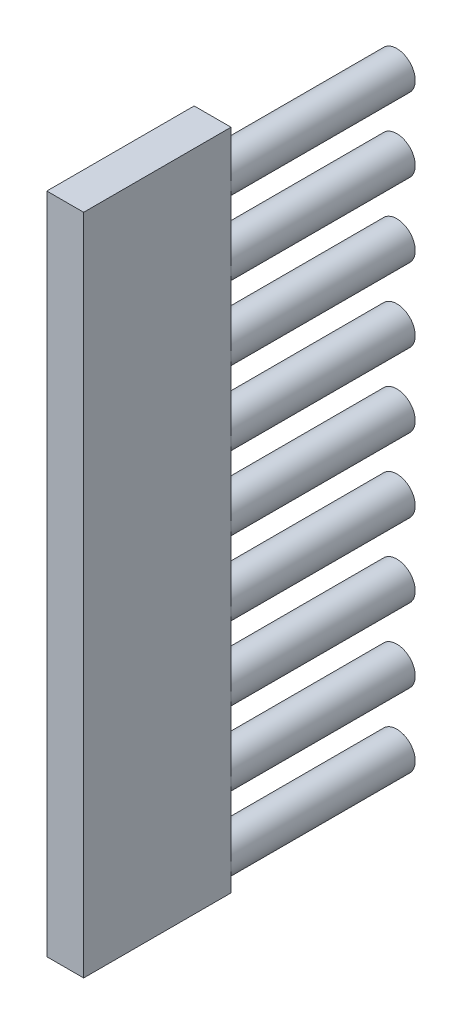
ISO-10303-21;
HEADER;
FILE_DESCRIPTION(('STEP AP214'),'2;1');
FILE_NAME('part.step','',(''),(''),'','','');
FILE_SCHEMA(('AUTOMOTIVE_DESIGN { 1 0 10303 214 1 1 1 1 }'));
ENDSEC;
DATA;
#1=APPLICATION_CONTEXT('core data for automotive mechanical design processes');
#2=APPLICATION_PROTOCOL_DEFINITION('international standard','automotive_design',2000,#1);
#3=PRODUCT_CONTEXT('',#1,'mechanical');
#4=PRODUCT('Part','Part','',(#3));
#5=PRODUCT_RELATED_PRODUCT_CATEGORY('part','',(#4));
#6=PRODUCT_DEFINITION_FORMATION('','',#4);
#7=PRODUCT_DEFINITION_CONTEXT('part definition',#1,'design');
#8=PRODUCT_DEFINITION('design','',#6,#7);
#9=PRODUCT_DEFINITION_SHAPE('','',#8);
#10=(LENGTH_UNIT() NAMED_UNIT(*) SI_UNIT(.MILLI.,.METRE.));
#11=(NAMED_UNIT(*) PLANE_ANGLE_UNIT() SI_UNIT($,.RADIAN.));
#12=(NAMED_UNIT(*) SI_UNIT($,.STERADIAN.) SOLID_ANGLE_UNIT());
#13=UNCERTAINTY_MEASURE_WITH_UNIT(LENGTH_MEASURE(1.E-05),#10,'distance_accuracy_value','');
#14=(GEOMETRIC_REPRESENTATION_CONTEXT(3) GLOBAL_UNCERTAINTY_ASSIGNED_CONTEXT((#13)) GLOBAL_UNIT_ASSIGNED_CONTEXT((#10,
#11,#12)) REPRESENTATION_CONTEXT('',''));
#15=CARTESIAN_POINT('',(0.,0.,0.));
#16=DIRECTION('',(0.,0.,1.));
#17=DIRECTION('',(1.,0.,0.));
#18=AXIS2_PLACEMENT_3D('',#15,#16,#17);
#19=CARTESIAN_POINT('',(5.,0.,0.));
#20=DIRECTION('',(0.,0.,1.));
#21=DIRECTION('',(1.,0.,0.));
#22=AXIS2_PLACEMENT_3D('',#19,#20,#21);
#23=PLANE('',#22);
#24=CARTESIAN_POINT('',(2.5,3.,0.));
#25=DIRECTION('',(0.,0.,-1.));
#26=DIRECTION('',(-1.,0.,0.));
#27=AXIS2_PLACEMENT_3D('',#24,#25,#26);
#28=CIRCLE('',#27,2.5);
#29=CARTESIAN_POINT('',(0.,3.,0.));
#30=VERTEX_POINT('',#29);
#31=CARTESIAN_POINT('',(5.,3.,0.));
#32=VERTEX_POINT('',#31);
#33=EDGE_CURVE('E50',#30,#32,#28,.T.);
#34=ORIENTED_EDGE('',*,*,#33,.F.);
#35=DIRECTION('',(0.,1.,0.));
#36=VECTOR('',#35,1.);
#37=CARTESIAN_POINT('',(0.,0.,0.));
#38=LINE('',#37,#36);
#39=CARTESIAN_POINT('',(1.0321604682062E-13,13.,0.));
#40=VERTEX_POINT('',#39);
#41=EDGE_CURVE('E192',#30,#40,#38,.T.);
#42=ORIENTED_EDGE('',*,*,#41,.T.);
#43=CARTESIAN_POINT('',(2.5000000000001,13.,0.));
#44=DIRECTION('',(0.,0.,-1.));
#45=DIRECTION('',(-1.,0.,0.));
#46=AXIS2_PLACEMENT_3D('',#43,#44,#45);
#47=CIRCLE('',#46,2.5);
#48=CARTESIAN_POINT('',(5.,13.,0.));
#49=VERTEX_POINT('',#48);
#50=EDGE_CURVE('E48',#49,#40,#47,.T.);
#51=ORIENTED_EDGE('',*,*,#50,.F.);
#52=DIRECTION('',(0.,1.,0.));
#53=VECTOR('',#52,1.);
#54=CARTESIAN_POINT('',(5.,0.,0.));
#55=LINE('',#54,#53);
#56=EDGE_CURVE('E184',#32,#49,#55,.T.);
#57=ORIENTED_EDGE('',*,*,#56,.F.);
#58=EDGE_LOOP('',(#34,#42,#51,#57));
#59=FACE_BOUND('',#58,.T.);
#60=ADVANCED_FACE('F39',(#59),#23,.F.);
#61=EDGE_CURVE('E239',#40,#49,#47,.T.);
#62=ORIENTED_EDGE('',*,*,#61,.F.);
#63=CARTESIAN_POINT('',(2.08166817117217E-13,23.,0.));
#64=VERTEX_POINT('',#63);
#65=EDGE_CURVE('E496',#40,#64,#38,.T.);
#66=ORIENTED_EDGE('',*,*,#65,.T.);
#67=CARTESIAN_POINT('',(2.50000000000021,23.,0.));
#68=DIRECTION('',(0.,0.,-1.));
#69=DIRECTION('',(-1.,0.,0.));
#70=AXIS2_PLACEMENT_3D('',#67,#68,#69);
#71=CIRCLE('',#70,2.5);
#72=CARTESIAN_POINT('',(5.,23.,0.));
#73=VERTEX_POINT('',#72);
#74=EDGE_CURVE('E247',#73,#64,#71,.T.);
#75=ORIENTED_EDGE('',*,*,#74,.F.);
#76=EDGE_CURVE('E224',#49,#73,#55,.T.);
#77=ORIENTED_EDGE('',*,*,#76,.F.);
#78=EDGE_LOOP('',(#62,#66,#75,#77));
#79=FACE_BOUND('',#78,.T.);
#80=ADVANCED_FACE('F301',(#79),#23,.F.);
#81=EDGE_CURVE('E245',#64,#73,#71,.T.);
#82=ORIENTED_EDGE('',*,*,#81,.F.);
#83=CARTESIAN_POINT('',(3.10949183068843E-13,33.,0.));
#84=VERTEX_POINT('',#83);
#85=EDGE_CURVE('E498',#64,#84,#38,.T.);
#86=ORIENTED_EDGE('',*,*,#85,.T.);
#87=CARTESIAN_POINT('',(2.50000000000031,33.,0.));
#88=DIRECTION('',(0.,0.,-1.));
#89=DIRECTION('',(-1.,0.,0.));
#90=AXIS2_PLACEMENT_3D('',#87,#88,#89);
#91=CIRCLE('',#90,2.5);
#92=CARTESIAN_POINT('',(5.,33.,0.));
#93=VERTEX_POINT('',#92);
#94=EDGE_CURVE('E249',#93,#84,#91,.T.);
#95=ORIENTED_EDGE('',*,*,#94,.F.);
#96=EDGE_CURVE('E220',#73,#93,#55,.T.);
#97=ORIENTED_EDGE('',*,*,#96,.F.);
#98=EDGE_LOOP('',(#82,#86,#95,#97));
#99=FACE_BOUND('',#98,.T.);
#100=ADVANCED_FACE('F307',(#99),#23,.F.);
#101=EDGE_CURVE('E255',#84,#93,#91,.T.);
#102=ORIENTED_EDGE('',*,*,#101,.F.);
#103=CARTESIAN_POINT('',(4.15032591627451E-13,43.,0.));
#104=VERTEX_POINT('',#103);
#105=EDGE_CURVE('E345',#84,#104,#38,.T.);
#106=ORIENTED_EDGE('',*,*,#105,.T.);
#107=CARTESIAN_POINT('',(2.50000000000042,43.,0.));
#108=DIRECTION('',(0.,0.,-1.));
#109=DIRECTION('',(-1.,0.,0.));
#110=AXIS2_PLACEMENT_3D('',#107,#108,#109);
#111=CIRCLE('',#110,2.5);
#112=CARTESIAN_POINT('',(5.,43.,0.));
#113=VERTEX_POINT('',#112);
#114=EDGE_CURVE('E253',#113,#104,#111,.T.);
#115=ORIENTED_EDGE('',*,*,#114,.F.);
#116=EDGE_CURVE('E216',#93,#113,#55,.T.);
#117=ORIENTED_EDGE('',*,*,#116,.F.);
#118=EDGE_LOOP('',(#102,#106,#115,#117));
#119=FACE_BOUND('',#118,.T.);
#120=ADVANCED_FACE('F343',(#119),#23,.F.);
#121=EDGE_CURVE('E266',#104,#113,#111,.T.);
#122=ORIENTED_EDGE('',*,*,#121,.F.);
#123=CARTESIAN_POINT('',(5.19983361924048E-13,53.,0.));
#124=VERTEX_POINT('',#123);
#125=EDGE_CURVE('E348',#104,#124,#38,.T.);
#126=ORIENTED_EDGE('',*,*,#125,.T.);
#127=CARTESIAN_POINT('',(2.50000000000052,53.,0.));
#128=DIRECTION('',(0.,0.,-1.));
#129=DIRECTION('',(-1.,0.,0.));
#130=AXIS2_PLACEMENT_3D('',#127,#128,#129);
#131=CIRCLE('',#130,2.5);
#132=CARTESIAN_POINT('',(5.,53.,0.));
#133=VERTEX_POINT('',#132);
#134=EDGE_CURVE('E274',#133,#124,#131,.T.);
#135=ORIENTED_EDGE('',*,*,#134,.F.);
#136=EDGE_CURVE('E212',#113,#133,#55,.T.);
#137=ORIENTED_EDGE('',*,*,#136,.F.);
#138=EDGE_LOOP('',(#122,#126,#135,#137));
#139=FACE_BOUND('',#138,.T.);
#140=ADVANCED_FACE('F330',(#139),#23,.F.);
#141=EDGE_CURVE('E271',#124,#133,#131,.T.);
#142=ORIENTED_EDGE('',*,*,#141,.F.);
#143=CARTESIAN_POINT('',(6.24066770482656E-13,63.,0.));
#144=VERTEX_POINT('',#143);
#145=EDGE_CURVE('E351',#124,#144,#38,.T.);
#146=ORIENTED_EDGE('',*,*,#145,.T.);
#147=CARTESIAN_POINT('',(2.50000000000062,63.,0.));
#148=DIRECTION('',(0.,0.,-1.));
#149=DIRECTION('',(-1.,0.,0.));
#150=AXIS2_PLACEMENT_3D('',#147,#148,#149);
#151=CIRCLE('',#150,2.5);
#152=CARTESIAN_POINT('',(5.,63.,0.));
#153=VERTEX_POINT('',#152);
#154=EDGE_CURVE('E168',#153,#144,#151,.T.);
#155=ORIENTED_EDGE('',*,*,#154,.F.);
#156=EDGE_CURVE('E210',#133,#153,#55,.T.);
#157=ORIENTED_EDGE('',*,*,#156,.F.);
#158=EDGE_LOOP('',(#142,#146,#155,#157));
#159=FACE_BOUND('',#158,.T.);
#160=ADVANCED_FACE('F326',(#159),#23,.F.);
#161=EDGE_CURVE('E277',#144,#153,#151,.T.);
#162=ORIENTED_EDGE('',*,*,#161,.F.);
#163=CARTESIAN_POINT('',(7.28150179041265E-13,73.,0.));
#164=VERTEX_POINT('',#163);
#165=EDGE_CURVE('E144',#144,#164,#38,.T.);
#166=ORIENTED_EDGE('',*,*,#165,.T.);
#167=CARTESIAN_POINT('',(2.50000000000073,73.,0.));
#168=DIRECTION('',(0.,0.,-1.));
#169=DIRECTION('',(-1.,0.,0.));
#170=AXIS2_PLACEMENT_3D('',#167,#168,#169);
#171=CIRCLE('',#170,2.5);
#172=CARTESIAN_POINT('',(5.,73.,0.));
#173=VERTEX_POINT('',#172);
#174=EDGE_CURVE('E65',#173,#164,#171,.T.);
#175=ORIENTED_EDGE('',*,*,#174,.F.);
#176=EDGE_CURVE('E209',#153,#173,#55,.T.);
#177=ORIENTED_EDGE('',*,*,#176,.F.);
#178=EDGE_LOOP('',(#162,#166,#175,#177));
#179=FACE_BOUND('',#178,.T.);
#180=ADVANCED_FACE('F322',(#179),#23,.F.);
#181=EDGE_CURVE('E141',#164,#173,#171,.T.);
#182=ORIENTED_EDGE('',*,*,#181,.F.);
#183=CARTESIAN_POINT('',(8.32233587599873E-13,83.,0.));
#184=VERTEX_POINT('',#183);
#185=EDGE_CURVE('E137',#164,#184,#38,.T.);
#186=ORIENTED_EDGE('',*,*,#185,.T.);
#187=CARTESIAN_POINT('',(2.50000000000083,83.,0.));
#188=DIRECTION('',(0.,0.,-1.));
#189=DIRECTION('',(-1.,0.,0.));
#190=AXIS2_PLACEMENT_3D('',#187,#188,#189);
#191=CIRCLE('',#190,2.5);
#192=CARTESIAN_POINT('',(5.,83.,0.));
#193=VERTEX_POINT('',#192);
#194=EDGE_CURVE('E57',#193,#184,#191,.T.);
#195=ORIENTED_EDGE('',*,*,#194,.F.);
#196=EDGE_CURVE('E208',#173,#193,#55,.T.);
#197=ORIENTED_EDGE('',*,*,#196,.F.);
#198=EDGE_LOOP('',(#182,#186,#195,#197));
#199=FACE_BOUND('',#198,.T.);
#200=ADVANCED_FACE('F139',(#199),#23,.F.);
#201=EDGE_CURVE('E159',#184,#193,#191,.T.);
#202=ORIENTED_EDGE('',*,*,#201,.F.);
#203=CARTESIAN_POINT('',(0.,90.,0.));
#204=VERTEX_POINT('',#203);
#205=EDGE_CURVE('E145',#184,#204,#38,.T.);
#206=ORIENTED_EDGE('',*,*,#205,.T.);
#207=DIRECTION('',(-1.,0.,0.));
#208=VECTOR('',#207,1.);
#209=CARTESIAN_POINT('',(5.,90.,0.));
#210=LINE('',#209,#208);
#211=CARTESIAN_POINT('',(5.,90.,0.));
#212=VERTEX_POINT('',#211);
#213=EDGE_CURVE('E171',#212,#204,#210,.T.);
#214=ORIENTED_EDGE('',*,*,#213,.F.);
#215=EDGE_CURVE('E161',#193,#212,#55,.T.);
#216=ORIENTED_EDGE('',*,*,#215,.F.);
#217=EDGE_LOOP('',(#202,#206,#214,#216));
#218=FACE_BOUND('',#217,.T.);
#219=ADVANCED_FACE('F160',(#218),#23,.F.);
#220=CARTESIAN_POINT('',(5.,0.,0.));
#221=DIRECTION('',(0.,1.,0.));
#222=DIRECTION('',(0.,0.,1.));
#223=AXIS2_PLACEMENT_3D('',#220,#221,#222);
#224=PLANE('',#223);
#225=DIRECTION('',(0.,0.,-1.));
#226=VECTOR('',#225,1.);
#227=CARTESIAN_POINT('',(0.,0.,0.));
#228=LINE('',#227,#226);
#229=CARTESIAN_POINT('',(0.,0.,20.));
#230=VERTEX_POINT('',#229);
#231=CARTESIAN_POINT('',(0.,0.,0.));
#232=VERTEX_POINT('',#231);
#233=EDGE_CURVE('E156',#230,#232,#228,.T.);
#234=ORIENTED_EDGE('',*,*,#233,.T.);
#235=DIRECTION('',(-1.,0.,0.));
#236=VECTOR('',#235,1.);
#237=CARTESIAN_POINT('',(5.,0.,0.));
#238=LINE('',#237,#236);
#239=CARTESIAN_POINT('',(5.,0.,0.));
#240=VERTEX_POINT('',#239);
#241=EDGE_CURVE('E43',#240,#232,#238,.T.);
#242=ORIENTED_EDGE('',*,*,#241,.F.);
#243=DIRECTION('',(0.,0.,-1.));
#244=VECTOR('',#243,1.);
#245=CARTESIAN_POINT('',(5.,0.,0.));
#246=LINE('',#245,#244);
#247=CARTESIAN_POINT('',(5.,0.,20.));
#248=VERTEX_POINT('',#247);
#249=EDGE_CURVE('E176',#248,#240,#246,.T.);
#250=ORIENTED_EDGE('',*,*,#249,.F.);
#251=DIRECTION('',(-1.,0.,0.));
#252=VECTOR('',#251,1.);
#253=CARTESIAN_POINT('',(5.,0.,20.));
#254=LINE('',#253,#252);
#255=EDGE_CURVE('E188',#248,#230,#254,.T.);
#256=ORIENTED_EDGE('',*,*,#255,.T.);
#257=EDGE_LOOP('',(#234,#242,#250,#256));
#258=FACE_BOUND('',#257,.T.);
#259=ADVANCED_FACE('F41',(#258),#224,.F.);
#260=EDGE_CURVE('E11',#32,#30,#28,.T.);
#261=ORIENTED_EDGE('',*,*,#260,.F.);
#262=EDGE_CURVE('E180',#240,#32,#55,.T.);
#263=ORIENTED_EDGE('',*,*,#262,.F.);
#264=ORIENTED_EDGE('',*,*,#241,.T.);
#265=EDGE_CURVE('E157',#232,#30,#38,.T.);
#266=ORIENTED_EDGE('',*,*,#265,.T.);
#267=EDGE_LOOP('',(#261,#263,#264,#266));
#268=FACE_BOUND('',#267,.T.);
#269=ADVANCED_FACE('F302',(#268),#23,.F.);
#270=CARTESIAN_POINT('',(5.,90.,0.));
#271=DIRECTION('',(0.,-1.,0.));
#272=DIRECTION('',(0.,0.,-1.));
#273=AXIS2_PLACEMENT_3D('',#270,#271,#272);
#274=PLANE('',#273);
#275=DIRECTION('',(0.,0.,1.));
#276=VECTOR('',#275,1.);
#277=CARTESIAN_POINT('',(0.,90.,0.));
#278=LINE('',#277,#276);
#279=CARTESIAN_POINT('',(0.,90.,20.));
#280=VERTEX_POINT('',#279);
#281=EDGE_CURVE('E152',#204,#280,#278,.T.);
#282=ORIENTED_EDGE('',*,*,#281,.T.);
#283=DIRECTION('',(-1.,0.,0.));
#284=VECTOR('',#283,1.);
#285=CARTESIAN_POINT('',(5.,90.,20.));
#286=LINE('',#285,#284);
#287=CARTESIAN_POINT('',(5.,90.,20.));
#288=VERTEX_POINT('',#287);
#289=EDGE_CURVE('E197',#288,#280,#286,.T.);
#290=ORIENTED_EDGE('',*,*,#289,.F.);
#291=DIRECTION('',(0.,0.,1.));
#292=VECTOR('',#291,1.);
#293=CARTESIAN_POINT('',(5.,90.,0.));
#294=LINE('',#293,#292);
#295=EDGE_CURVE('E183',#212,#288,#294,.T.);
#296=ORIENTED_EDGE('',*,*,#295,.F.);
#297=ORIENTED_EDGE('',*,*,#213,.T.);
#298=EDGE_LOOP('',(#282,#290,#296,#297));
#299=FACE_BOUND('',#298,.T.);
#300=ADVANCED_FACE('F201',(#299),#274,.F.);
#301=CARTESIAN_POINT('',(5.,0.,20.));
#302=DIRECTION('',(0.,0.,-1.));
#303=DIRECTION('',(-1.,0.,0.));
#304=AXIS2_PLACEMENT_3D('',#301,#302,#303);
#305=PLANE('',#304);
#306=DIRECTION('',(0.,-1.,0.));
#307=VECTOR('',#306,1.);
#308=CARTESIAN_POINT('',(0.,0.,20.));
#309=LINE('',#308,#307);
#310=EDGE_CURVE('E179',#280,#230,#309,.T.);
#311=ORIENTED_EDGE('',*,*,#310,.T.);
#312=ORIENTED_EDGE('',*,*,#255,.F.);
#313=DIRECTION('',(0.,-1.,0.));
#314=VECTOR('',#313,1.);
#315=CARTESIAN_POINT('',(5.,0.,20.));
#316=LINE('',#315,#314);
#317=EDGE_CURVE('E186',#288,#248,#316,.T.);
#318=ORIENTED_EDGE('',*,*,#317,.F.);
#319=ORIENTED_EDGE('',*,*,#289,.T.);
#320=EDGE_LOOP('',(#311,#312,#318,#319));
#321=FACE_BOUND('',#320,.T.);
#322=ADVANCED_FACE('F316',(#321),#305,.F.);
#323=CARTESIAN_POINT('',(5.,0.,0.));
#324=DIRECTION('',(-1.,0.,0.));
#325=DIRECTION('',(0.,0.,1.));
#326=AXIS2_PLACEMENT_3D('',#323,#324,#325);
#327=PLANE('',#326);
#328=ORIENTED_EDGE('',*,*,#249,.T.);
#329=ORIENTED_EDGE('',*,*,#262,.T.);
#330=ORIENTED_EDGE('',*,*,#56,.T.);
#331=ORIENTED_EDGE('',*,*,#76,.T.);
#332=ORIENTED_EDGE('',*,*,#96,.T.);
#333=ORIENTED_EDGE('',*,*,#116,.T.);
#334=ORIENTED_EDGE('',*,*,#136,.T.);
#335=ORIENTED_EDGE('',*,*,#156,.T.);
#336=ORIENTED_EDGE('',*,*,#176,.T.);
#337=ORIENTED_EDGE('',*,*,#196,.T.);
#338=ORIENTED_EDGE('',*,*,#215,.T.);
#339=ORIENTED_EDGE('',*,*,#295,.T.);
#340=ORIENTED_EDGE('',*,*,#317,.T.);
#341=EDGE_LOOP('',(#328,#329,#330,#331,#332,#333,#334,#335,#336,#337,#338,#339,#340));
#342=FACE_BOUND('',#341,.T.);
#343=ADVANCED_FACE('F205',(#342),#327,.F.);
#344=CARTESIAN_POINT('',(0.,0.,0.));
#345=DIRECTION('',(-1.,0.,0.));
#346=DIRECTION('',(0.,0.,1.));
#347=AXIS2_PLACEMENT_3D('',#344,#345,#346);
#348=PLANE('',#347);
#349=ORIENTED_EDGE('',*,*,#233,.F.);
#350=ORIENTED_EDGE('',*,*,#310,.F.);
#351=ORIENTED_EDGE('',*,*,#281,.F.);
#352=ORIENTED_EDGE('',*,*,#205,.F.);
#353=ORIENTED_EDGE('',*,*,#185,.F.);
#354=ORIENTED_EDGE('',*,*,#165,.F.);
#355=ORIENTED_EDGE('',*,*,#145,.F.);
#356=ORIENTED_EDGE('',*,*,#125,.F.);
#357=ORIENTED_EDGE('',*,*,#105,.F.);
#358=ORIENTED_EDGE('',*,*,#85,.F.);
#359=ORIENTED_EDGE('',*,*,#65,.F.);
#360=ORIENTED_EDGE('',*,*,#41,.F.);
#361=ORIENTED_EDGE('',*,*,#265,.F.);
#362=EDGE_LOOP('',(#349,#350,#351,#352,#353,#354,#355,#356,#357,#358,#359,#360,#361));
#363=FACE_BOUND('',#362,.T.);
#364=ADVANCED_FACE('F150',(#363),#348,.T.);
#365=CARTESIAN_POINT('',(2.50000000000083,83.,-25.));
#366=DIRECTION('',(0.,0.,1.));
#367=DIRECTION('',(1.,0.,0.));
#368=AXIS2_PLACEMENT_3D('',#365,#366,#367);
#369=CYLINDRICAL_SURFACE('',#368,2.5);
#370=CARTESIAN_POINT('',(2.50000000000083,83.,-25.));
#371=DIRECTION('',(0.,0.,-1.));
#372=DIRECTION('',(-1.,0.,0.));
#373=AXIS2_PLACEMENT_3D('',#370,#371,#372);
#374=CIRCLE('',#373,2.5);
#375=CARTESIAN_POINT('',(8.32233587599873E-13,83.,-25.));
#376=VERTEX_POINT('',#375);
#377=EDGE_CURVE('E165',#376,#376,#374,.T.);
#378=ORIENTED_EDGE('',*,*,#377,.F.);
#379=EDGE_LOOP('',(#378));
#380=FACE_BOUND('',#379,.T.);
#381=ORIENTED_EDGE('',*,*,#201,.T.);
#382=ORIENTED_EDGE('',*,*,#194,.T.);
#383=EDGE_LOOP('',(#381,#382));
#384=FACE_BOUND('',#383,.T.);
#385=ADVANCED_FACE('F167',(#380,#384),#369,.T.);
#386=CARTESIAN_POINT('',(2.50000000000083,83.,-25.));
#387=DIRECTION('',(0.,0.,-1.));
#388=DIRECTION('',(-1.,0.,0.));
#389=AXIS2_PLACEMENT_3D('',#386,#387,#388);
#390=PLANE('',#389);
#391=ORIENTED_EDGE('',*,*,#377,.T.);
#392=EDGE_LOOP('',(#391));
#393=FACE_BOUND('',#392,.T.);
#394=ADVANCED_FACE('F289',(#393),#390,.T.);
#395=CARTESIAN_POINT('',(2.50000000000073,73.,-25.));
#396=DIRECTION('',(0.,0.,1.));
#397=DIRECTION('',(1.,0.,0.));
#398=AXIS2_PLACEMENT_3D('',#395,#396,#397);
#399=CYLINDRICAL_SURFACE('',#398,2.5);
#400=CARTESIAN_POINT('',(2.50000000000073,73.,-25.));
#401=DIRECTION('',(0.,0.,-1.));
#402=DIRECTION('',(-1.,0.,0.));
#403=AXIS2_PLACEMENT_3D('',#400,#401,#402);
#404=CIRCLE('',#403,2.5);
#405=CARTESIAN_POINT('',(7.28150179041265E-13,73.,-25.));
#406=VERTEX_POINT('',#405);
#407=EDGE_CURVE('E164',#406,#406,#404,.T.);
#408=ORIENTED_EDGE('',*,*,#407,.F.);
#409=EDGE_LOOP('',(#408));
#410=FACE_BOUND('',#409,.T.);
#411=ORIENTED_EDGE('',*,*,#181,.T.);
#412=ORIENTED_EDGE('',*,*,#174,.T.);
#413=EDGE_LOOP('',(#411,#412));
#414=FACE_BOUND('',#413,.T.);
#415=ADVANCED_FACE('F287',(#410,#414),#399,.T.);
#416=CARTESIAN_POINT('',(2.50000000000073,73.,-25.));
#417=DIRECTION('',(0.,0.,-1.));
#418=DIRECTION('',(-1.,0.,0.));
#419=AXIS2_PLACEMENT_3D('',#416,#417,#418);
#420=PLANE('',#419);
#421=ORIENTED_EDGE('',*,*,#407,.T.);
#422=EDGE_LOOP('',(#421));
#423=FACE_BOUND('',#422,.T.);
#424=ADVANCED_FACE('F285',(#423),#420,.T.);
#425=CARTESIAN_POINT('',(2.50000000000062,63.,-25.));
#426=DIRECTION('',(0.,0.,1.));
#427=DIRECTION('',(1.,0.,0.));
#428=AXIS2_PLACEMENT_3D('',#425,#426,#427);
#429=CYLINDRICAL_SURFACE('',#428,2.5);
#430=CARTESIAN_POINT('',(2.50000000000062,63.,-25.));
#431=DIRECTION('',(0.,0.,-1.));
#432=DIRECTION('',(-1.,0.,0.));
#433=AXIS2_PLACEMENT_3D('',#430,#431,#432);
#434=CIRCLE('',#433,2.5);
#435=CARTESIAN_POINT('',(6.24066770482656E-13,63.,-25.));
#436=VERTEX_POINT('',#435);
#437=EDGE_CURVE('E279',#436,#436,#434,.T.);
#438=ORIENTED_EDGE('',*,*,#437,.F.);
#439=EDGE_LOOP('',(#438));
#440=FACE_BOUND('',#439,.T.);
#441=ORIENTED_EDGE('',*,*,#161,.T.);
#442=ORIENTED_EDGE('',*,*,#154,.T.);
#443=EDGE_LOOP('',(#441,#442));
#444=FACE_BOUND('',#443,.T.);
#445=ADVANCED_FACE('F295',(#440,#444),#429,.T.);
#446=CARTESIAN_POINT('',(2.50000000000062,63.,-25.));
#447=DIRECTION('',(0.,0.,-1.));
#448=DIRECTION('',(-1.,0.,0.));
#449=AXIS2_PLACEMENT_3D('',#446,#447,#448);
#450=PLANE('',#449);
#451=ORIENTED_EDGE('',*,*,#437,.T.);
#452=EDGE_LOOP('',(#451));
#453=FACE_BOUND('',#452,.T.);
#454=ADVANCED_FACE('F355',(#453),#450,.T.);
#455=CARTESIAN_POINT('',(2.50000000000052,53.,-25.));
#456=DIRECTION('',(0.,0.,1.));
#457=DIRECTION('',(1.,0.,0.));
#458=AXIS2_PLACEMENT_3D('',#455,#456,#457);
#459=CYLINDRICAL_SURFACE('',#458,2.5);
#460=CARTESIAN_POINT('',(2.50000000000052,53.,-25.));
#461=DIRECTION('',(0.,0.,-1.));
#462=DIRECTION('',(-1.,0.,0.));
#463=AXIS2_PLACEMENT_3D('',#460,#461,#462);
#464=CIRCLE('',#463,2.5);
#465=CARTESIAN_POINT('',(5.19983361924048E-13,53.,-25.));
#466=VERTEX_POINT('',#465);
#467=EDGE_CURVE('E273',#466,#466,#464,.T.);
#468=ORIENTED_EDGE('',*,*,#467,.F.);
#469=EDGE_LOOP('',(#468));
#470=FACE_BOUND('',#469,.T.);
#471=ORIENTED_EDGE('',*,*,#141,.T.);
#472=ORIENTED_EDGE('',*,*,#134,.T.);
#473=EDGE_LOOP('',(#471,#472));
#474=FACE_BOUND('',#473,.T.);
#475=ADVANCED_FACE('F352',(#470,#474),#459,.T.);
#476=CARTESIAN_POINT('',(2.50000000000052,53.,-25.));
#477=DIRECTION('',(0.,0.,-1.));
#478=DIRECTION('',(-1.,0.,0.));
#479=AXIS2_PLACEMENT_3D('',#476,#477,#478);
#480=PLANE('',#479);
#481=ORIENTED_EDGE('',*,*,#467,.T.);
#482=EDGE_LOOP('',(#481));
#483=FACE_BOUND('',#482,.T.);
#484=ADVANCED_FACE('F354',(#483),#480,.T.);
#485=CARTESIAN_POINT('',(2.50000000000042,43.,-25.));
#486=DIRECTION('',(0.,0.,1.));
#487=DIRECTION('',(1.,0.,0.));
#488=AXIS2_PLACEMENT_3D('',#485,#486,#487);
#489=CYLINDRICAL_SURFACE('',#488,2.5);
#490=CARTESIAN_POINT('',(2.50000000000042,43.,-25.));
#491=DIRECTION('',(0.,0.,-1.));
#492=DIRECTION('',(-1.,0.,0.));
#493=AXIS2_PLACEMENT_3D('',#490,#491,#492);
#494=CIRCLE('',#493,2.5);
#495=CARTESIAN_POINT('',(4.15032591627451E-13,43.,-25.));
#496=VERTEX_POINT('',#495);
#497=EDGE_CURVE('E268',#496,#496,#494,.T.);
#498=ORIENTED_EDGE('',*,*,#497,.F.);
#499=EDGE_LOOP('',(#498));
#500=FACE_BOUND('',#499,.T.);
#501=ORIENTED_EDGE('',*,*,#121,.T.);
#502=ORIENTED_EDGE('',*,*,#114,.T.);
#503=EDGE_LOOP('',(#501,#502));
#504=FACE_BOUND('',#503,.T.);
#505=ADVANCED_FACE('F339',(#500,#504),#489,.T.);
#506=CARTESIAN_POINT('',(2.50000000000042,43.,-25.));
#507=DIRECTION('',(0.,0.,-1.));
#508=DIRECTION('',(-1.,0.,0.));
#509=AXIS2_PLACEMENT_3D('',#506,#507,#508);
#510=PLANE('',#509);
#511=ORIENTED_EDGE('',*,*,#497,.T.);
#512=EDGE_LOOP('',(#511));
#513=FACE_BOUND('',#512,.T.);
#514=ADVANCED_FACE('F367',(#513),#510,.T.);
#515=CARTESIAN_POINT('',(2.50000000000031,33.,-25.));
#516=DIRECTION('',(0.,0.,1.));
#517=DIRECTION('',(1.,0.,0.));
#518=AXIS2_PLACEMENT_3D('',#515,#516,#517);
#519=CYLINDRICAL_SURFACE('',#518,2.5);
#520=CARTESIAN_POINT('',(2.50000000000031,33.,-25.));
#521=DIRECTION('',(0.,0.,-1.));
#522=DIRECTION('',(-1.,0.,0.));
#523=AXIS2_PLACEMENT_3D('',#520,#521,#522);
#524=CIRCLE('',#523,2.5);
#525=CARTESIAN_POINT('',(3.10949183068843E-13,33.,-25.));
#526=VERTEX_POINT('',#525);
#527=EDGE_CURVE('E262',#526,#526,#524,.T.);
#528=ORIENTED_EDGE('',*,*,#527,.F.);
#529=EDGE_LOOP('',(#528));
#530=FACE_BOUND('',#529,.T.);
#531=ORIENTED_EDGE('',*,*,#101,.T.);
#532=ORIENTED_EDGE('',*,*,#94,.T.);
#533=EDGE_LOOP('',(#531,#532));
#534=FACE_BOUND('',#533,.T.);
#535=ADVANCED_FACE('F410',(#530,#534),#519,.T.);
#536=CARTESIAN_POINT('',(2.50000000000031,33.,-25.));
#537=DIRECTION('',(0.,0.,-1.));
#538=DIRECTION('',(-1.,0.,0.));
#539=AXIS2_PLACEMENT_3D('',#536,#537,#538);
#540=PLANE('',#539);
#541=ORIENTED_EDGE('',*,*,#527,.T.);
#542=EDGE_LOOP('',(#541));
#543=FACE_BOUND('',#542,.T.);
#544=ADVANCED_FACE('F419',(#543),#540,.T.);
#545=CARTESIAN_POINT('',(2.50000000000021,23.,-25.));
#546=DIRECTION('',(0.,0.,1.));
#547=DIRECTION('',(1.,0.,0.));
#548=AXIS2_PLACEMENT_3D('',#545,#546,#547);
#549=CYLINDRICAL_SURFACE('',#548,2.5);
#550=CARTESIAN_POINT('',(2.50000000000021,23.,-25.));
#551=DIRECTION('',(0.,0.,-1.));
#552=DIRECTION('',(-1.,0.,0.));
#553=AXIS2_PLACEMENT_3D('',#550,#551,#552);
#554=CIRCLE('',#553,2.5);
#555=CARTESIAN_POINT('',(2.08166817117217E-13,23.,-25.));
#556=VERTEX_POINT('',#555);
#557=EDGE_CURVE('E257',#556,#556,#554,.T.);
#558=ORIENTED_EDGE('',*,*,#557,.F.);
#559=EDGE_LOOP('',(#558));
#560=FACE_BOUND('',#559,.T.);
#561=ORIENTED_EDGE('',*,*,#81,.T.);
#562=ORIENTED_EDGE('',*,*,#74,.T.);
#563=EDGE_LOOP('',(#561,#562));
#564=FACE_BOUND('',#563,.T.);
#565=ADVANCED_FACE('F429',(#560,#564),#549,.T.);
#566=CARTESIAN_POINT('',(2.50000000000021,23.,-25.));
#567=DIRECTION('',(0.,0.,-1.));
#568=DIRECTION('',(-1.,0.,0.));
#569=AXIS2_PLACEMENT_3D('',#566,#567,#568);
#570=PLANE('',#569);
#571=ORIENTED_EDGE('',*,*,#557,.T.);
#572=EDGE_LOOP('',(#571));
#573=FACE_BOUND('',#572,.T.);
#574=ADVANCED_FACE('F439',(#573),#570,.T.);
#575=CARTESIAN_POINT('',(2.5000000000001,13.,-25.));
#576=DIRECTION('',(0.,0.,1.));
#577=DIRECTION('',(1.,0.,0.));
#578=AXIS2_PLACEMENT_3D('',#575,#576,#577);
#579=CYLINDRICAL_SURFACE('',#578,2.5);
#580=CARTESIAN_POINT('',(2.5000000000001,13.,-25.));
#581=DIRECTION('',(0.,0.,-1.));
#582=DIRECTION('',(-1.,0.,0.));
#583=AXIS2_PLACEMENT_3D('',#580,#581,#582);
#584=CIRCLE('',#583,2.5);
#585=CARTESIAN_POINT('',(1.0321604682062E-13,13.,-25.));
#586=VERTEX_POINT('',#585);
#587=EDGE_CURVE('E242',#586,#586,#584,.T.);
#588=ORIENTED_EDGE('',*,*,#587,.F.);
#589=EDGE_LOOP('',(#588));
#590=FACE_BOUND('',#589,.T.);
#591=ORIENTED_EDGE('',*,*,#61,.T.);
#592=ORIENTED_EDGE('',*,*,#50,.T.);
#593=EDGE_LOOP('',(#591,#592));
#594=FACE_BOUND('',#593,.T.);
#595=ADVANCED_FACE('F240',(#590,#594),#579,.T.);
#596=CARTESIAN_POINT('',(2.5000000000001,13.,-25.));
#597=DIRECTION('',(0.,0.,-1.));
#598=DIRECTION('',(-1.,0.,0.));
#599=AXIS2_PLACEMENT_3D('',#596,#597,#598);
#600=PLANE('',#599);
#601=ORIENTED_EDGE('',*,*,#587,.T.);
#602=EDGE_LOOP('',(#601));
#603=FACE_BOUND('',#602,.T.);
#604=ADVANCED_FACE('F457',(#603),#600,.T.);
#605=CARTESIAN_POINT('',(2.5,3.,-25.));
#606=DIRECTION('',(0.,0.,1.));
#607=DIRECTION('',(1.,0.,0.));
#608=AXIS2_PLACEMENT_3D('',#605,#606,#607);
#609=CYLINDRICAL_SURFACE('',#608,2.5);
#610=CARTESIAN_POINT('',(2.5,3.,-25.));
#611=DIRECTION('',(0.,0.,-1.));
#612=DIRECTION('',(-1.,0.,0.));
#613=AXIS2_PLACEMENT_3D('',#610,#611,#612);
#614=CIRCLE('',#613,2.5);
#615=CARTESIAN_POINT('',(0.,3.,-25.));
#616=VERTEX_POINT('',#615);
#617=EDGE_CURVE('E190',#616,#616,#614,.T.);
#618=ORIENTED_EDGE('',*,*,#617,.F.);
#619=EDGE_LOOP('',(#618));
#620=FACE_BOUND('',#619,.T.);
#621=ORIENTED_EDGE('',*,*,#33,.T.);
#622=ORIENTED_EDGE('',*,*,#260,.T.);
#623=EDGE_LOOP('',(#621,#622));
#624=FACE_BOUND('',#623,.T.);
#625=ADVANCED_FACE('F467',(#620,#624),#609,.T.);
#626=CARTESIAN_POINT('',(2.5,3.,-25.));
#627=DIRECTION('',(0.,0.,-1.));
#628=DIRECTION('',(-1.,0.,0.));
#629=AXIS2_PLACEMENT_3D('',#626,#627,#628);
#630=PLANE('',#629);
#631=ORIENTED_EDGE('',*,*,#617,.T.);
#632=EDGE_LOOP('',(#631));
#633=FACE_BOUND('',#632,.T.);
#634=ADVANCED_FACE('F477',(#633),#630,.T.);
#635=CLOSED_SHELL('',(#60,#80,#100,#120,#140,#160,#180,#200,#219,#259,#269,#300,#322,#343,#364,
#385,#394,#415,#424,#445,#454,#475,#484,#505,#514,#535,#544,#565,#574,#595,#604,#625,#634));
#636=MANIFOLD_SOLID_BREP('B2',#635);
#637=ADVANCED_BREP_SHAPE_REPRESENTATION('',(#18,#636),#14);
#638=SHAPE_DEFINITION_REPRESENTATION(#9,#637);
ENDSEC;
END-ISO-10303-21;
